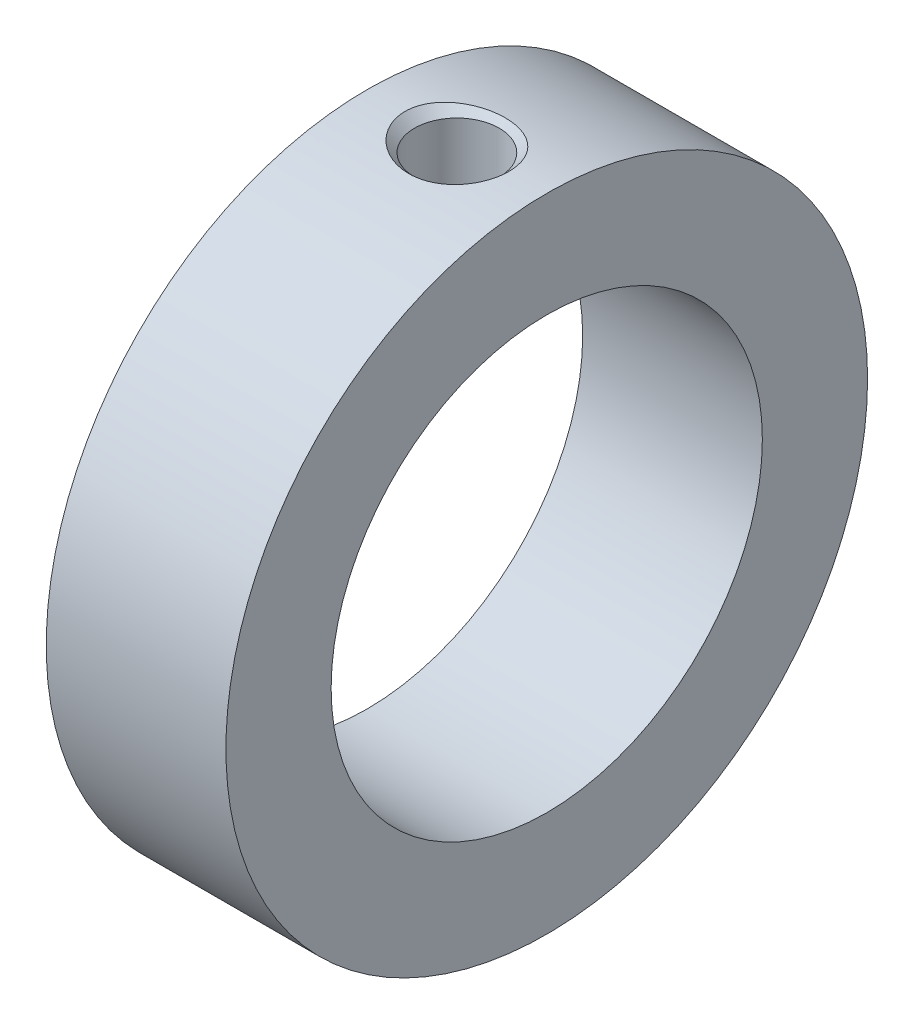
ISO-10303-21;
HEADER;
FILE_DESCRIPTION(('STEP AP214'),'2;1');
FILE_NAME('part.step','',(''),(''),'','','');
FILE_SCHEMA(('AUTOMOTIVE_DESIGN { 1 0 10303 214 1 1 1 1 }'));
ENDSEC;
DATA;
#1=APPLICATION_CONTEXT('core data for automotive mechanical design processes');
#2=APPLICATION_PROTOCOL_DEFINITION('international standard','automotive_design',2000,#1);
#3=PRODUCT_CONTEXT('',#1,'mechanical');
#4=PRODUCT('Part','Part','',(#3));
#5=PRODUCT_RELATED_PRODUCT_CATEGORY('part','',(#4));
#6=PRODUCT_DEFINITION_FORMATION('','',#4);
#7=PRODUCT_DEFINITION_CONTEXT('part definition',#1,'design');
#8=PRODUCT_DEFINITION('design','',#6,#7);
#9=PRODUCT_DEFINITION_SHAPE('','',#8);
#10=(LENGTH_UNIT() NAMED_UNIT(*) SI_UNIT(.MILLI.,.METRE.));
#11=(NAMED_UNIT(*) PLANE_ANGLE_UNIT() SI_UNIT($,.RADIAN.));
#12=(NAMED_UNIT(*) SI_UNIT($,.STERADIAN.) SOLID_ANGLE_UNIT());
#13=UNCERTAINTY_MEASURE_WITH_UNIT(LENGTH_MEASURE(1.E-05),#10,'distance_accuracy_value','');
#14=(GEOMETRIC_REPRESENTATION_CONTEXT(3) GLOBAL_UNCERTAINTY_ASSIGNED_CONTEXT((#13)) GLOBAL_UNIT_ASSIGNED_CONTEXT((#10,
#11,#12)) REPRESENTATION_CONTEXT('',''));
#15=CARTESIAN_POINT('',(0.,0.,0.));
#16=DIRECTION('',(0.,0.,1.));
#17=DIRECTION('',(1.,0.,0.));
#18=AXIS2_PLACEMENT_3D('',#15,#16,#17);
#19=CARTESIAN_POINT('',(7.,0.,0.));
#20=DIRECTION('',(1.,0.,0.));
#21=DIRECTION('',(0.,0.,-1.));
#22=AXIS2_PLACEMENT_3D('',#19,#20,#21);
#23=PLANE('',#22);
#24=CARTESIAN_POINT('',(7.,0.,0.));
#25=DIRECTION('',(1.,0.,0.));
#26=DIRECTION('',(0.,0.,-1.));
#27=AXIS2_PLACEMENT_3D('',#24,#25,#26);
#28=CIRCLE('',#27,12.5);
#29=CARTESIAN_POINT('',(7.,0.,-12.5));
#30=VERTEX_POINT('',#29);
#31=EDGE_CURVE('E52',#30,#30,#28,.T.);
#32=ORIENTED_EDGE('',*,*,#31,.T.);
#33=EDGE_LOOP('',(#32));
#34=FACE_BOUND('',#33,.T.);
#35=CARTESIAN_POINT('',(7.,0.,0.));
#36=DIRECTION('',(1.,0.,0.));
#37=DIRECTION('',(0.,0.,-1.));
#38=AXIS2_PLACEMENT_3D('',#35,#36,#37);
#39=CIRCLE('',#38,8.4);
#40=CARTESIAN_POINT('',(7.,0.,-8.4));
#41=VERTEX_POINT('',#40);
#42=EDGE_CURVE('E90',#41,#41,#39,.T.);
#43=ORIENTED_EDGE('',*,*,#42,.F.);
#44=EDGE_LOOP('',(#43));
#45=FACE_BOUND('',#44,.T.);
#46=ADVANCED_FACE('F39',(#34,#45),#23,.T.);
#47=CARTESIAN_POINT('',(0.,0.,0.));
#48=DIRECTION('',(1.,0.,0.));
#49=DIRECTION('',(0.,0.,-1.));
#50=AXIS2_PLACEMENT_3D('',#47,#48,#49);
#51=PLANE('',#50);
#52=CARTESIAN_POINT('',(0.,0.,0.));
#53=DIRECTION('',(1.,0.,0.));
#54=DIRECTION('',(0.,0.,-1.));
#55=AXIS2_PLACEMENT_3D('',#52,#53,#54);
#56=CIRCLE('',#55,12.5);
#57=CARTESIAN_POINT('',(0.,0.,-12.5));
#58=VERTEX_POINT('',#57);
#59=EDGE_CURVE('E56',#58,#58,#56,.T.);
#60=ORIENTED_EDGE('',*,*,#59,.F.);
#61=EDGE_LOOP('',(#60));
#62=FACE_BOUND('',#61,.T.);
#63=CARTESIAN_POINT('',(0.,0.,0.));
#64=DIRECTION('',(1.,0.,0.));
#65=DIRECTION('',(0.,0.,-1.));
#66=AXIS2_PLACEMENT_3D('',#63,#64,#65);
#67=CIRCLE('',#66,8.4);
#68=CARTESIAN_POINT('',(0.,0.,-8.4));
#69=VERTEX_POINT('',#68);
#70=EDGE_CURVE('E88',#69,#69,#67,.T.);
#71=ORIENTED_EDGE('',*,*,#70,.T.);
#72=EDGE_LOOP('',(#71));
#73=FACE_BOUND('',#72,.T.);
#74=ADVANCED_FACE('F76',(#62,#73),#51,.F.);
#75=CARTESIAN_POINT('',(7.,0.,0.));
#76=DIRECTION('',(-1.,0.,0.));
#77=DIRECTION('',(0.,0.,1.));
#78=AXIS2_PLACEMENT_3D('',#75,#76,#77);
#79=CYLINDRICAL_SURFACE('',#78,12.5);
#80=CARTESIAN_POINT('',(2.11672415070622,12.424315698018,-1.37345534434114));
#81=CARTESIAN_POINT('',(2.18924225793108,12.4173372525632,-1.4365850067981));
#82=CARTESIAN_POINT('',(2.266381223118,12.4104547642461,-1.49444664142568));
#83=CARTESIAN_POINT('',(2.42811857936019,12.3974458693989,-1.59878244213381));
#84=CARTESIAN_POINT('',(2.51272365181073,12.3913201521083,-1.64524626490919));
#85=CARTESIAN_POINT('',(2.70419021287676,12.3792715653524,-1.73378488321217));
#86=CARTESIAN_POINT('',(2.81223242149234,12.3736067719823,-1.77336239009544));
#87=CARTESIAN_POINT('',(3.03336097709774,12.3646573109873,-1.8347243842184));
#88=CARTESIAN_POINT('',(3.1464493554985,12.3613736112527,-1.85650163629301));
#89=CARTESIAN_POINT('',(3.37904756103009,12.3574651557986,-1.88234991252504));
#90=CARTESIAN_POINT('',(3.49863810569443,12.3569461788033,-1.88571667238053));
#91=CARTESIAN_POINT('',(3.73672876243348,12.3589131276424,-1.87278020189079));
#92=CARTESIAN_POINT('',(3.85522880246968,12.3613992505777,-1.85647568133095));
#93=CARTESIAN_POINT('',(4.08903535916475,12.3691327161642,-1.8042330817294));
#94=CARTESIAN_POINT('',(4.20429600132862,12.3744084322808,-1.76809310641349));
#95=CARTESIAN_POINT('',(4.42689993111649,12.3871158157037,-1.67674606587653));
#96=CARTESIAN_POINT('',(4.53424299282824,12.3945475444976,-1.62153845685406));
#97=CARTESIAN_POINT('',(4.73564558987722,12.4105107460157,-1.49440203764703));
#98=CARTESIAN_POINT('',(4.82991596288244,12.4190190588113,-1.42280516377971));
#99=CARTESIAN_POINT('',(5.00418155204766,12.4361905839088,-1.26393145071513));
#100=CARTESIAN_POINT('',(5.08418109491387,12.4448537483826,-1.1766593801668));
#101=CARTESIAN_POINT('',(5.22272320381166,12.4607448738238,-0.993867196355644));
#102=CARTESIAN_POINT('',(5.2822030223335,12.4680255312549,-0.899063479826653));
#103=CARTESIAN_POINT('',(5.38291392769243,12.4807754949357,-0.700101117780141));
#104=CARTESIAN_POINT('',(5.42415606226387,12.4862458972661,-0.595948181815656));
#105=CARTESIAN_POINT('',(5.48396295524845,12.4943071613777,-0.389971208327178));
#106=CARTESIAN_POINT('',(5.50403716001879,12.4970882885648,-0.288591961610335));
#107=CARTESIAN_POINT('',(5.52601457331643,12.5001372120244,-0.0838557344138476));
#108=CARTESIAN_POINT('',(5.52792436451902,12.5004059187826,0.0195005160044454));
#109=CARTESIAN_POINT('',(5.5138720586579,12.4984514745792,0.219571385238797));
#110=CARTESIAN_POINT('',(5.49882757164015,12.4963562585085,0.31635340482468));
#111=CARTESIAN_POINT('',(5.45298001609223,12.4901139153237,0.506026223951382));
#112=CARTESIAN_POINT('',(5.42217684529811,12.4859667748938,0.598916998236234));
#113=CARTESIAN_POINT('',(5.34566033022722,12.476016124135,0.779274102526891));
#114=CARTESIAN_POINT('',(5.29980668038324,12.4701970941154,0.866679793670038));
#115=CARTESIAN_POINT('',(5.19491663683861,12.457516164471,1.03308643041952));
#116=CARTESIAN_POINT('',(5.13587717055609,12.4506540218975,1.11208541073427));
#117=CARTESIAN_POINT('',(5.00255666683275,12.4361207391533,1.26456411757231));
#118=CARTESIAN_POINT('',(4.92757252838948,12.428425765015,1.33742617632787));
#119=CARTESIAN_POINT('',(4.76712755667945,12.4133790041791,1.47055099918353));
#120=CARTESIAN_POINT('',(4.68166336412268,12.406027328571,1.53080970655483));
#121=CARTESIAN_POINT('',(4.49597428256797,12.3918707019047,1.64161371770218));
#122=CARTESIAN_POINT('',(4.39512712623189,12.3851449635366,1.69112739944933));
#123=CARTESIAN_POINT('',(4.18676882619382,12.3736070786832,1.77357999348229));
#124=CARTESIAN_POINT('',(4.07925594842894,12.3687954325767,1.80651457228252));
#125=CARTESIAN_POINT('',(3.85463913903687,12.3613944954312,1.85650452690646));
#126=CARTESIAN_POINT('',(3.73732702172053,12.3589334918566,1.87264715462866));
#127=CARTESIAN_POINT('',(3.5016080226614,12.3569555247193,1.88565434089452));
#128=CARTESIAN_POINT('',(3.38320097912318,12.3574390034303,1.88251600335544));
#129=CARTESIAN_POINT('',(3.14615827267865,12.3613359062109,1.8567575995128));
#130=CARTESIAN_POINT('',(3.02756550922833,12.3648078061494,1.83374868610346));
#131=CARTESIAN_POINT('',(2.7960073557363,12.3743558709108,1.76816477311962));
#132=CARTESIAN_POINT('',(2.68304231933074,12.3804321991614,1.72558854568531));
#133=CARTESIAN_POINT('',(2.46709038033403,12.3944062337448,1.6221541263995));
#134=CARTESIAN_POINT('',(2.36402740726234,12.4022881581781,1.56145303638146));
#135=CARTESIAN_POINT('',(2.17019655448027,12.4189448226217,1.42290507264111));
#136=CARTESIAN_POINT('',(2.07942665993706,12.4277194159098,1.34506101415324));
#137=CARTESIAN_POINT('',(1.91710954511418,12.4446680960533,1.17770612669206));
#138=CARTESIAN_POINT('',(1.84491029270881,12.4528518676084,1.08883018833284));
#139=CARTESIAN_POINT('',(1.71785455487446,12.4679664810204,0.899338034622718));
#140=CARTESIAN_POINT('',(1.66298846741301,12.4748980156631,0.798728361840405));
#141=CARTESIAN_POINT('',(1.57650950410473,12.4861317407946,0.596640607895747));
#142=CARTESIAN_POINT('',(1.54347409879,12.4905907828316,0.495780062021483));
#143=CARTESIAN_POINT('',(1.49601009332349,12.4970663736345,0.289706960293659));
#144=CARTESIAN_POINT('',(1.48157200672932,12.4990841676424,0.184496651533652));
#145=CARTESIAN_POINT('',(1.47231437906444,12.5003742431252,-0.0197974446052887));
#146=CARTESIAN_POINT('',(1.47626041354688,12.4998192878144,-0.118826191825575));
#147=CARTESIAN_POINT('',(1.50079783854281,12.496420506149,-0.314759051343923));
#148=CARTESIAN_POINT('',(1.52138946201841,12.4935766477604,-0.4116631338869));
#149=CARTESIAN_POINT('',(1.57799979902458,12.4859659823063,-0.599499985905617));
#150=CARTESIAN_POINT('',(1.61383514502049,12.4812220695133,-0.690489366601389));
#151=CARTESIAN_POINT('',(1.69952795537757,12.4703113834387,-0.865459973622434));
#152=CARTESIAN_POINT('',(1.74938035648971,12.4641451240822,-0.949443716350471));
#153=CARTESIAN_POINT('',(1.85005492231085,12.4523309544302,-1.09248519224416));
#154=CARTESIAN_POINT('',(1.89864135654629,12.4468304748069,-1.15314868785849));
#155=CARTESIAN_POINT('',(2.0027251814163,12.4356377159168,-1.26816846183674));
#156=CARTESIAN_POINT('',(2.05822097511729,12.4299454811907,-1.32252619203802));
#157=CARTESIAN_POINT('',(2.11672415070622,12.424315698018,-1.37345534434114));
#158=B_SPLINE_CURVE_WITH_KNOTS('',3,(#80,#81,#82,#83,#84,#85,#86,#87,#88,#89,#90,#91,#92,#93,
#94,#95,#96,#97,#98,#99,#100,#101,#102,#103,#104,#105,#106,#107,#108,#109,#110,#111,#112,#113,
#114,#115,#116,#117,#118,#119,#120,#121,#122,#123,#124,#125,#126,#127,#128,#129,#130,#131,#132,
#133,#134,#135,#136,#137,#138,#139,#140,#141,#142,#143,#144,#145,#146,#147,#148,#149,#150,#151,
#152,#153,#154,#155,#156,#157),.UNSPECIFIED.,.T.,.F.,(4,2,2,2,2,2,2,2,2,2,2,2,2,2,2,2,2,2,2,2,2,
2,2,2,2,2,2,2,2,2,2,2,2,2,2,2,2,2,4),(0.,0.288991087317388,0.578243466538491,0.922270247301934,
1.26643679317185,1.62368133517925,1.98094930968179,2.34192307165189,2.70290712930192,
3.05714185526477,3.4112689992446,3.74594383394648,4.0804156559963,4.38897288901154,
4.69741829846085,4.98993910241594,5.28246180467112,5.57779286219393,5.87319281020866,
6.1863584018362,6.4996246396595,6.8357834207639,7.1720300222901,7.52572615940148,
7.87947542447105,8.24030822547527,8.60116367203052,8.95897788210964,9.31673337536211,
9.65931465812441,10.0017058274062,10.3187093758921,10.6355511575981,10.9314367867951,
11.2273265571093,11.5197534538059,11.8120748552887,12.0452689949165,12.2784093369905),.UNSPECIFIED.);
#159=CARTESIAN_POINT('',(2.11672415070622,12.424315698018,-1.37345534434114));
#160=VERTEX_POINT('',#159);
#161=EDGE_CURVE('E10',#160,#160,#158,.T.);
#162=ORIENTED_EDGE('',*,*,#161,.T.);
#163=EDGE_LOOP('',(#162));
#164=FACE_BOUND('',#163,.T.);
#165=ORIENTED_EDGE('',*,*,#31,.F.);
#166=EDGE_LOOP('',(#165));
#167=FACE_BOUND('',#166,.T.);
#168=ORIENTED_EDGE('',*,*,#59,.T.);
#169=EDGE_LOOP('',(#168));
#170=FACE_BOUND('',#169,.T.);
#171=ADVANCED_FACE('F41',(#164,#167,#170),#79,.T.);
#172=CARTESIAN_POINT('',(7.,0.,0.));
#173=DIRECTION('',(-1.,0.,0.));
#174=DIRECTION('',(0.,0.,1.));
#175=AXIS2_PLACEMENT_3D('',#172,#173,#174);
#176=CYLINDRICAL_SURFACE('',#175,8.4);
#177=CARTESIAN_POINT('',(3.5,8.23635234797541,1.65));
#178=CARTESIAN_POINT('',(3.40828318692765,8.23635415964816,1.64999657071966));
#179=CARTESIAN_POINT('',(3.31652280779366,8.23790098258457,1.64232678635621));
#180=CARTESIAN_POINT('',(3.13559543168173,8.24391246105314,1.61187443580262));
#181=CARTESIAN_POINT('',(3.04643060798692,8.24837949223857,1.58907956479714));
#182=CARTESIAN_POINT('',(2.87333816421521,8.25970639035835,1.52910909296765));
#183=CARTESIAN_POINT('',(2.78940552434164,8.26656392084459,1.49194753013998));
#184=CARTESIAN_POINT('',(2.62896934079698,8.28189637217835,1.40433662934922));
#185=CARTESIAN_POINT('',(2.55246533491184,8.29037119229973,1.35388811883397));
#186=CARTESIAN_POINT('',(2.40800966358429,8.30811251149959,1.24040157221547));
#187=CARTESIAN_POINT('',(2.34017411055001,8.31738742937644,1.17721703094458));
#188=CARTESIAN_POINT('',(2.21599403639729,8.33560972214608,1.04036856472129));
#189=CARTESIAN_POINT('',(2.15965030560159,8.34455707447665,0.966703919615675));
#190=CARTESIAN_POINT('',(2.0596043403184,8.36120673377592,0.810219222334134));
#191=CARTESIAN_POINT('',(2.0160121954051,8.36889795869986,0.727327505994124));
#192=CARTESIAN_POINT('',(1.94341688715867,8.38207429688148,0.555220152542567));
#193=CARTESIAN_POINT('',(1.91441240690221,8.38755960927226,0.466005087110784));
#194=CARTESIAN_POINT('',(1.8721765138178,8.39564660344174,0.284988023871476));
#195=CARTESIAN_POINT('',(1.85874912497196,8.3982840839623,0.193233378159244));
#196=CARTESIAN_POINT('',(1.84743736735635,8.40050180739761,0.00873834504859489));
#197=CARTESIAN_POINT('',(1.84955155167771,8.40008233491243,-0.0840019497839082));
#198=CARTESIAN_POINT('',(1.86911380127402,8.39626122405211,-0.266489849204792));
#199=CARTESIAN_POINT('',(1.88635079270365,8.39290063733585,-0.356261064769681));
#200=CARTESIAN_POINT('',(1.93533484961763,8.38362111651754,-0.531611585930199));
#201=CARTESIAN_POINT('',(1.96708248095249,8.3777020826479,-0.617190727909473));
#202=CARTESIAN_POINT('',(2.0443837835965,8.3639027960147,-0.782332916098613));
#203=CARTESIAN_POINT('',(2.09002063905261,8.35601077913971,-0.861856001509962));
#204=CARTESIAN_POINT('',(2.19374345055426,8.33913634583569,-1.01219375223987));
#205=CARTESIAN_POINT('',(2.25183079069909,8.33015380822348,-1.08300744797176));
#206=CARTESIAN_POINT('',(2.37996514292471,8.31191306141042,-1.21516831195769));
#207=CARTESIAN_POINT('',(2.45019686341255,8.30265275663273,-1.27633624241143));
#208=CARTESIAN_POINT('',(2.60001425019014,8.28504378950297,-1.38605428087429));
#209=CARTESIAN_POINT('',(2.67960008108921,8.27669514319884,-1.43460416678858));
#210=CARTESIAN_POINT('',(2.84611817272693,8.26185094407666,-1.51776663681077));
#211=CARTESIAN_POINT('',(2.93306484707439,8.25535914133434,-1.55235107350514));
#212=CARTESIAN_POINT('',(3.11169170246706,8.24501934121898,-1.60636859607393));
#213=CARTESIAN_POINT('',(3.20337128877705,8.24117101253361,-1.62580358070319));
#214=CARTESIAN_POINT('',(3.38723941951759,8.23662001712054,-1.64870443838214));
#215=CARTESIAN_POINT('',(3.47939454912947,8.23586644580972,-1.65242875873487));
#216=CARTESIAN_POINT('',(3.66300946228015,8.2374537698958,-1.64449724856721));
#217=CARTESIAN_POINT('',(3.7544692834926,8.23979449641619,-1.63284225739872));
#218=CARTESIAN_POINT('',(3.93323423394803,8.24725907879918,-1.59470550419112));
#219=CARTESIAN_POINT('',(4.02056983500271,8.25235714340767,-1.56836107289418));
#220=CARTESIAN_POINT('',(4.18958751087999,8.26473947830222,-1.50173977210742));
#221=CARTESIAN_POINT('',(4.27126913349259,8.27202392320879,-1.46146178974196));
#222=CARTESIAN_POINT('',(4.42779335360173,8.28807306224028,-1.36752883867617));
#223=CARTESIAN_POINT('',(4.50253680225306,8.29685525239014,-1.31371170148379));
#224=CARTESIAN_POINT('',(4.64202606900143,8.31486199508646,-1.19444501043563));
#225=CARTESIAN_POINT('',(4.70677089506824,8.32408659140815,-1.12899430371952));
#226=CARTESIAN_POINT('',(4.82540075286276,8.34210350306366,-0.987159882319832));
#227=CARTESIAN_POINT('',(4.87911130883599,8.35088742386571,-0.910628998967263));
#228=CARTESIAN_POINT('',(4.97291223314338,8.36688869280503,-0.749479948090159));
#229=CARTESIAN_POINT('',(5.01300316016657,8.37410610519744,-0.66486211248194));
#230=CARTESIAN_POINT('',(5.07817047155934,8.38612523135752,-0.490406628483913));
#231=CARTESIAN_POINT('',(5.10332996950468,8.39094029308828,-0.400600987237876));
#232=CARTESIAN_POINT('',(5.13818415438061,8.39766935205844,-0.217934529260181));
#233=CARTESIAN_POINT('',(5.14788063491392,8.39958368576088,-0.125074068141916));
#234=CARTESIAN_POINT('',(5.15146611822195,8.40028800872532,0.0593975880322564));
#235=CARTESIAN_POINT('',(5.14561778515143,8.39912991411139,0.151003581718052));
#236=CARTESIAN_POINT('',(5.11885824644466,8.39392828745359,0.331900383000584));
#237=CARTESIAN_POINT('',(5.09794721662279,8.38988478908864,0.421191217607651));
#238=CARTESIAN_POINT('',(5.04177087285804,8.37936771822815,0.594766631051604));
#239=CARTESIAN_POINT('',(5.00653607293116,8.37289931379074,0.67906141830177));
#240=CARTESIAN_POINT('',(4.92274506230432,8.35822999575489,0.840580655023893));
#241=CARTESIAN_POINT('',(4.87418784480404,8.35002895122834,0.91780456954811));
#242=CARTESIAN_POINT('',(4.76423903980687,8.33263558287687,1.0642916906927));
#243=CARTESIAN_POINT('',(4.70265899157479,8.32342978690906,1.13341186075992));
#244=CARTESIAN_POINT('',(4.56880092182361,8.30514592308402,1.26042812180923));
#245=CARTESIAN_POINT('',(4.49652037601755,8.29606788592043,1.31832155689891));
#246=CARTESIAN_POINT('',(4.34241881836993,8.27896444840501,1.42180682962775));
#247=CARTESIAN_POINT('',(4.26050704290072,8.27095087872484,1.46726554216689));
#248=CARTESIAN_POINT('',(4.09007464032511,8.2570275487703,1.54370259786998));
#249=CARTESIAN_POINT('',(4.00156016670338,8.25111585853435,1.57469423304023));
#250=CARTESIAN_POINT('',(3.84402266392242,8.24326111341229,1.6152230935992));
#251=CARTESIAN_POINT('',(3.77590532038373,8.24068618595314,1.62824138840845));
#252=CARTESIAN_POINT('',(3.63853357922211,8.23723114632188,1.64563099739335));
#253=CARTESIAN_POINT('',(3.56927921832958,8.23635097951015,1.65000259034143));
#254=CARTESIAN_POINT('',(3.5,8.23635234797541,1.65));
#255=B_SPLINE_CURVE_WITH_KNOTS('',3,(#177,#178,#179,#180,#181,#182,#183,#184,#185,#186,#187,
#188,#189,#190,#191,#192,#193,#194,#195,#196,#197,#198,#199,#200,#201,#202,#203,#204,#205,#206,
#207,#208,#209,#210,#211,#212,#213,#214,#215,#216,#217,#218,#219,#220,#221,#222,#223,#224,#225,
#226,#227,#228,#229,#230,#231,#232,#233,#234,#235,#236,#237,#238,#239,#240,#241,#242,#243,#244,
#245,#246,#247,#248,#249,#250,#251,#252,#253,#254),.UNSPECIFIED.,.T.,.F.,(4,2,2,2,2,2,2,2,2,2,2,
2,2,2,2,2,2,2,2,2,2,2,2,2,2,2,2,2,2,2,2,2,2,2,2,2,2,2,4),(0.,0.274896815559694,
0.550017544456572,0.824870123803733,1.09970559068648,1.37790425580595,1.65612204693023,
1.93667533984596,2.21720330084355,2.49416228420956,2.77109548322741,3.04422385058264,
3.31736286964001,3.59217106221818,3.86700982061701,4.14647082729001,4.42593675252559,
4.70596316418836,4.98595447312719,5.26132139267892,5.53667328423768,5.80949307391776,
6.08233465880434,6.35861433451216,6.63492140418861,6.91530849780475,7.19568408830903,
7.47448400468932,7.75325157986138,8.02733882605202,8.30142287310128,8.57492607164578,
8.84844994504071,9.12624227572962,9.40410024339174,9.68482584577962,9.9652930140363,
10.1729457867424,10.3805918645476),.UNSPECIFIED.);
#256=CARTESIAN_POINT('',(3.5,8.23635234797541,1.65));
#257=VERTEX_POINT('',#256);
#258=EDGE_CURVE('E44',#257,#257,#255,.T.);
#259=ORIENTED_EDGE('',*,*,#258,.F.);
#260=EDGE_LOOP('',(#259));
#261=FACE_BOUND('',#260,.T.);
#262=ORIENTED_EDGE('',*,*,#42,.T.);
#263=EDGE_LOOP('',(#262));
#264=FACE_BOUND('',#263,.T.);
#265=ORIENTED_EDGE('',*,*,#70,.F.);
#266=EDGE_LOOP('',(#265));
#267=FACE_BOUND('',#266,.T.);
#268=ADVANCED_FACE('F66',(#261,#264,#267),#176,.F.);
#269=CARTESIAN_POINT('',(3.5,12.5,0.));
#270=DIRECTION('',(0.,1.,0.));
#271=DIRECTION('',(0.,0.,1.));
#272=AXIS2_PLACEMENT_3D('',#269,#270,#271);
#273=CONICAL_SURFACE('',#272,2.025,0.785398163397453);
#274=CARTESIAN_POINT('',(3.5,12.125,0.));
#275=DIRECTION('',(0.,1.,0.));
#276=DIRECTION('',(0.,0.,1.));
#277=AXIS2_PLACEMENT_3D('',#274,#275,#276);
#278=CIRCLE('',#277,1.65);
#279=CARTESIAN_POINT('',(3.5,12.125,1.65));
#280=VERTEX_POINT('',#279);
#281=EDGE_CURVE('E95',#280,#280,#278,.T.);
#282=ORIENTED_EDGE('',*,*,#281,.F.);
#283=EDGE_LOOP('',(#282));
#284=FACE_BOUND('',#283,.T.);
#285=ORIENTED_EDGE('',*,*,#161,.F.);
#286=EDGE_LOOP('',(#285));
#287=FACE_BOUND('',#286,.T.);
#288=ADVANCED_FACE('F62',(#284,#287),#273,.F.);
#289=CARTESIAN_POINT('',(3.5,12.5,0.));
#290=DIRECTION('',(0.,1.,0.));
#291=DIRECTION('',(0.,0.,1.));
#292=AXIS2_PLACEMENT_3D('',#289,#290,#291);
#293=CYLINDRICAL_SURFACE('',#292,1.65);
#294=ORIENTED_EDGE('',*,*,#258,.T.);
#295=EDGE_LOOP('',(#294));
#296=FACE_BOUND('',#295,.T.);
#297=ORIENTED_EDGE('',*,*,#281,.T.);
#298=EDGE_LOOP('',(#297));
#299=FACE_BOUND('',#298,.T.);
#300=ADVANCED_FACE('F65',(#296,#299),#293,.F.);
#301=CLOSED_SHELL('',(#46,#74,#171,#268,#288,#300));
#302=MANIFOLD_SOLID_BREP('B2',#301);
#303=ADVANCED_BREP_SHAPE_REPRESENTATION('',(#18,#302),#14);
#304=SHAPE_DEFINITION_REPRESENTATION(#9,#303);
ENDSEC;
END-ISO-10303-21;
